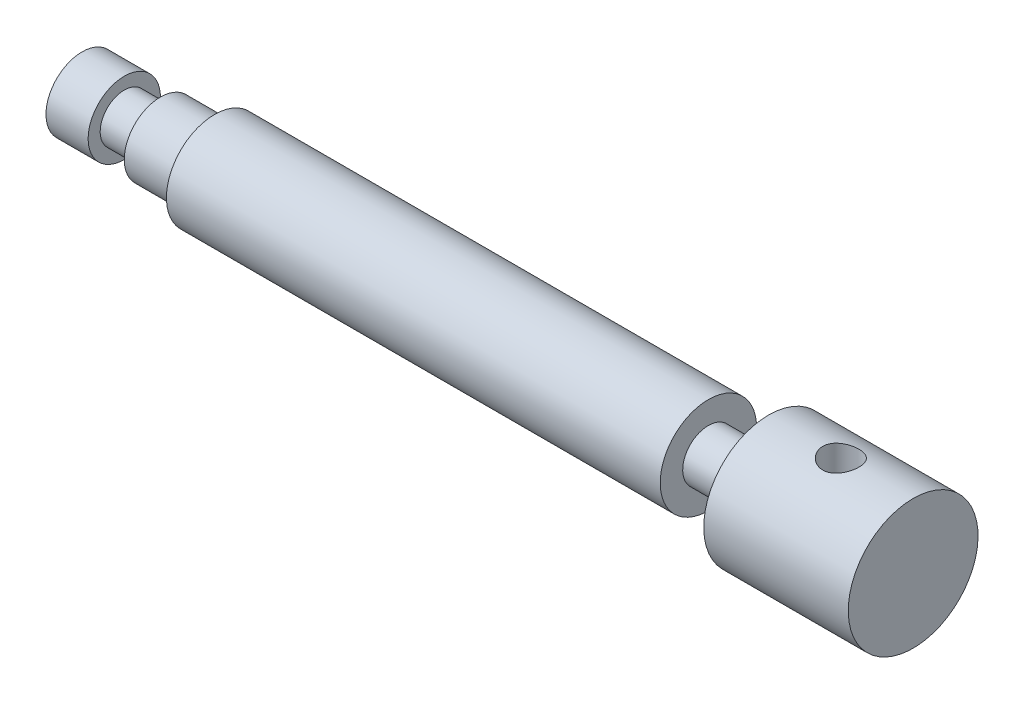
ISO-10303-21;
HEADER;
FILE_DESCRIPTION(('STEP AP214'),'2;1');
FILE_NAME('part.step','',(''),(''),'','','');
FILE_SCHEMA(('AUTOMOTIVE_DESIGN { 1 0 10303 214 1 1 1 1 }'));
ENDSEC;
DATA;
#1=APPLICATION_CONTEXT('core data for automotive mechanical design processes');
#2=APPLICATION_PROTOCOL_DEFINITION('international standard','automotive_design',2000,#1);
#3=PRODUCT_CONTEXT('',#1,'mechanical');
#4=PRODUCT('Part','Part','',(#3));
#5=PRODUCT_RELATED_PRODUCT_CATEGORY('part','',(#4));
#6=PRODUCT_DEFINITION_FORMATION('','',#4);
#7=PRODUCT_DEFINITION_CONTEXT('part definition',#1,'design');
#8=PRODUCT_DEFINITION('design','',#6,#7);
#9=PRODUCT_DEFINITION_SHAPE('','',#8);
#10=(LENGTH_UNIT() NAMED_UNIT(*) SI_UNIT(.MILLI.,.METRE.));
#11=(NAMED_UNIT(*) PLANE_ANGLE_UNIT() SI_UNIT($,.RADIAN.));
#12=(NAMED_UNIT(*) SI_UNIT($,.STERADIAN.) SOLID_ANGLE_UNIT());
#13=UNCERTAINTY_MEASURE_WITH_UNIT(LENGTH_MEASURE(1.E-05),#10,'distance_accuracy_value','');
#14=(GEOMETRIC_REPRESENTATION_CONTEXT(3) GLOBAL_UNCERTAINTY_ASSIGNED_CONTEXT((#13)) GLOBAL_UNIT_ASSIGNED_CONTEXT((#10,
#11,#12)) REPRESENTATION_CONTEXT('',''));
#15=CARTESIAN_POINT('',(0.,0.,0.));
#16=DIRECTION('',(0.,0.,1.));
#17=DIRECTION('',(1.,0.,0.));
#18=AXIS2_PLACEMENT_3D('',#15,#16,#17);
#19=CARTESIAN_POINT('',(41.,8.,0.));
#20=DIRECTION('',(1.,0.,0.));
#21=DIRECTION('',(0.,1.,0.));
#22=AXIS2_PLACEMENT_3D('',#19,#20,#21);
#23=PLANE('',#22);
#24=CARTESIAN_POINT('',(41.,0.,0.));
#25=DIRECTION('',(1.,0.,0.));
#26=DIRECTION('',(0.,1.,0.));
#27=AXIS2_PLACEMENT_3D('',#24,#25,#26);
#28=CIRCLE('',#27,8.);
#29=CARTESIAN_POINT('',(41.,8.,0.));
#30=VERTEX_POINT('',#29);
#31=EDGE_CURVE('E50',#30,#30,#28,.T.);
#32=ORIENTED_EDGE('',*,*,#31,.T.);
#33=EDGE_LOOP('',(#32));
#34=FACE_BOUND('',#33,.T.);
#35=CARTESIAN_POINT('',(41.,0.,0.));
#36=DIRECTION('',(1.,0.,0.));
#37=DIRECTION('',(0.,1.,0.));
#38=AXIS2_PLACEMENT_3D('',#35,#36,#37);
#39=CIRCLE('',#38,4.26787410544416);
#40=CARTESIAN_POINT('',(41.,4.26787410544416,0.));
#41=VERTEX_POINT('',#40);
#42=EDGE_CURVE('E93',#41,#41,#39,.T.);
#43=ORIENTED_EDGE('',*,*,#42,.F.);
#44=EDGE_LOOP('',(#43));
#45=FACE_BOUND('',#44,.T.);
#46=ADVANCED_FACE('F39',(#34,#45),#23,.T.);
#47=CARTESIAN_POINT('',(75.,0.,0.));
#48=DIRECTION('',(1.,0.,0.));
#49=DIRECTION('',(0.,1.,0.));
#50=AXIS2_PLACEMENT_3D('',#47,#48,#49);
#51=CYLINDRICAL_SURFACE('',#50,8.);
#52=CARTESIAN_POINT('',(-41.,0.,0.));
#53=DIRECTION('',(1.,0.,0.));
#54=DIRECTION('',(0.,1.,0.));
#55=AXIS2_PLACEMENT_3D('',#52,#53,#54);
#56=CIRCLE('',#55,7.99999999999999);
#57=CARTESIAN_POINT('',(-41.,7.99999999999999,0.));
#58=VERTEX_POINT('',#57);
#59=EDGE_CURVE('E54',#58,#58,#56,.T.);
#60=ORIENTED_EDGE('',*,*,#59,.T.);
#61=EDGE_LOOP('',(#60));
#62=FACE_BOUND('',#61,.T.);
#63=ORIENTED_EDGE('',*,*,#31,.F.);
#64=EDGE_LOOP('',(#63));
#65=FACE_BOUND('',#64,.T.);
#66=ADVANCED_FACE('F82',(#62,#65),#51,.T.);
#67=CARTESIAN_POINT('',(-41.,7.99999999999999,0.));
#68=DIRECTION('',(-1.,0.,0.));
#69=DIRECTION('',(0.,-1.,0.));
#70=AXIS2_PLACEMENT_3D('',#67,#68,#69);
#71=PLANE('',#70);
#72=CARTESIAN_POINT('',(-41.,0.,0.));
#73=DIRECTION('',(1.,0.,0.));
#74=DIRECTION('',(0.,1.,0.));
#75=AXIS2_PLACEMENT_3D('',#72,#73,#74);
#76=CIRCLE('',#75,5.99999999999999);
#77=CARTESIAN_POINT('',(-41.,5.99999999999999,0.));
#78=VERTEX_POINT('',#77);
#79=EDGE_CURVE('E120',#78,#78,#76,.T.);
#80=ORIENTED_EDGE('',*,*,#79,.T.);
#81=EDGE_LOOP('',(#80));
#82=FACE_BOUND('',#81,.T.);
#83=ORIENTED_EDGE('',*,*,#59,.F.);
#84=EDGE_LOOP('',(#83));
#85=FACE_BOUND('',#84,.T.);
#86=ADVANCED_FACE('F87',(#82,#85),#71,.T.);
#87=CARTESIAN_POINT('',(75.,0.,0.));
#88=DIRECTION('',(1.,0.,0.));
#89=DIRECTION('',(0.,1.,0.));
#90=AXIS2_PLACEMENT_3D('',#87,#88,#89);
#91=CYLINDRICAL_SURFACE('',#90,5.99999999999999);
#92=CARTESIAN_POINT('',(-50.,0.,0.));
#93=DIRECTION('',(1.,0.,0.));
#94=DIRECTION('',(0.,1.,0.));
#95=AXIS2_PLACEMENT_3D('',#92,#93,#94);
#96=CIRCLE('',#95,5.99999999999999);
#97=CARTESIAN_POINT('',(-50.,5.99999999999999,0.));
#98=VERTEX_POINT('',#97);
#99=EDGE_CURVE('E117',#98,#98,#96,.T.);
#100=ORIENTED_EDGE('',*,*,#99,.T.);
#101=EDGE_LOOP('',(#100));
#102=FACE_BOUND('',#101,.T.);
#103=ORIENTED_EDGE('',*,*,#79,.F.);
#104=EDGE_LOOP('',(#103));
#105=FACE_BOUND('',#104,.T.);
#106=ADVANCED_FACE('F127',(#102,#105),#91,.T.);
#107=CARTESIAN_POINT('',(-50.,3.99999999999999,0.));
#108=DIRECTION('',(-1.,0.,0.));
#109=DIRECTION('',(0.,-1.,0.));
#110=AXIS2_PLACEMENT_3D('',#107,#108,#109);
#111=PLANE('',#110);
#112=CARTESIAN_POINT('',(-50.,0.,0.));
#113=DIRECTION('',(1.,0.,0.));
#114=DIRECTION('',(0.,1.,0.));
#115=AXIS2_PLACEMENT_3D('',#112,#113,#114);
#116=CIRCLE('',#115,3.99999999999999);
#117=CARTESIAN_POINT('',(-50.,3.99999999999999,0.));
#118=VERTEX_POINT('',#117);
#119=EDGE_CURVE('E114',#118,#118,#116,.T.);
#120=ORIENTED_EDGE('',*,*,#119,.T.);
#121=EDGE_LOOP('',(#120));
#122=FACE_BOUND('',#121,.T.);
#123=ORIENTED_EDGE('',*,*,#99,.F.);
#124=EDGE_LOOP('',(#123));
#125=FACE_BOUND('',#124,.T.);
#126=ADVANCED_FACE('F133',(#122,#125),#111,.T.);
#127=CARTESIAN_POINT('',(75.,0.,0.));
#128=DIRECTION('',(1.,0.,0.));
#129=DIRECTION('',(0.,1.,0.));
#130=AXIS2_PLACEMENT_3D('',#127,#128,#129);
#131=CYLINDRICAL_SURFACE('',#130,3.99999999999999);
#132=CARTESIAN_POINT('',(-56.,0.,0.));
#133=DIRECTION('',(1.,0.,0.));
#134=DIRECTION('',(0.,1.,0.));
#135=AXIS2_PLACEMENT_3D('',#132,#133,#134);
#136=CIRCLE('',#135,3.99999999999999);
#137=CARTESIAN_POINT('',(-56.,3.99999999999999,0.));
#138=VERTEX_POINT('',#137);
#139=EDGE_CURVE('E111',#138,#138,#136,.T.);
#140=ORIENTED_EDGE('',*,*,#139,.T.);
#141=EDGE_LOOP('',(#140));
#142=FACE_BOUND('',#141,.T.);
#143=ORIENTED_EDGE('',*,*,#119,.F.);
#144=EDGE_LOOP('',(#143));
#145=FACE_BOUND('',#144,.T.);
#146=ADVANCED_FACE('F139',(#142,#145),#131,.T.);
#147=CARTESIAN_POINT('',(-56.,5.99999999999998,0.));
#148=DIRECTION('',(1.,0.,0.));
#149=DIRECTION('',(0.,1.,0.));
#150=AXIS2_PLACEMENT_3D('',#147,#148,#149);
#151=PLANE('',#150);
#152=CARTESIAN_POINT('',(-56.,0.,0.));
#153=DIRECTION('',(1.,0.,0.));
#154=DIRECTION('',(0.,1.,0.));
#155=AXIS2_PLACEMENT_3D('',#152,#153,#154);
#156=CIRCLE('',#155,5.99999999999998);
#157=CARTESIAN_POINT('',(-56.,5.99999999999998,0.));
#158=VERTEX_POINT('',#157);
#159=EDGE_CURVE('E108',#158,#158,#156,.T.);
#160=ORIENTED_EDGE('',*,*,#159,.T.);
#161=EDGE_LOOP('',(#160));
#162=FACE_BOUND('',#161,.T.);
#163=ORIENTED_EDGE('',*,*,#139,.F.);
#164=EDGE_LOOP('',(#163));
#165=FACE_BOUND('',#164,.T.);
#166=ADVANCED_FACE('F143',(#162,#165),#151,.T.);
#167=CARTESIAN_POINT('',(75.,0.,0.));
#168=DIRECTION('',(1.,0.,0.));
#169=DIRECTION('',(0.,1.,0.));
#170=AXIS2_PLACEMENT_3D('',#167,#168,#169);
#171=CYLINDRICAL_SURFACE('',#170,5.99999999999998);
#172=CARTESIAN_POINT('',(-63.,0.,0.));
#173=DIRECTION('',(1.,0.,0.));
#174=DIRECTION('',(0.,1.,0.));
#175=AXIS2_PLACEMENT_3D('',#172,#173,#174);
#176=CIRCLE('',#175,5.99999999999998);
#177=CARTESIAN_POINT('',(-63.,5.99999999999998,0.));
#178=VERTEX_POINT('',#177);
#179=EDGE_CURVE('E105',#178,#178,#176,.T.);
#180=ORIENTED_EDGE('',*,*,#179,.T.);
#181=EDGE_LOOP('',(#180));
#182=FACE_BOUND('',#181,.T.);
#183=ORIENTED_EDGE('',*,*,#159,.F.);
#184=EDGE_LOOP('',(#183));
#185=FACE_BOUND('',#184,.T.);
#186=ADVANCED_FACE('F147',(#182,#185),#171,.T.);
#187=CARTESIAN_POINT('',(-62.9999999999971,0.,0.));
#188=DIRECTION('',(-1.,0.,0.));
#189=DIRECTION('',(0.,-1.,0.));
#190=AXIS2_PLACEMENT_3D('',#187,#188,#189);
#191=PLANE('',#190);
#192=ORIENTED_EDGE('',*,*,#179,.F.);
#193=EDGE_LOOP('',(#192));
#194=FACE_BOUND('',#193,.T.);
#195=ADVANCED_FACE('F151',(#194),#191,.T.);
#196=CARTESIAN_POINT('',(75.,10.7746327543004,0.));
#197=DIRECTION('',(1.,0.,0.));
#198=DIRECTION('',(0.,1.,0.));
#199=AXIS2_PLACEMENT_3D('',#196,#197,#198);
#200=PLANE('',#199);
#201=CARTESIAN_POINT('',(75.,0.,0.));
#202=DIRECTION('',(1.,0.,0.));
#203=DIRECTION('',(0.,1.,0.));
#204=AXIS2_PLACEMENT_3D('',#201,#202,#203);
#205=CIRCLE('',#204,10.7746327543004);
#206=CARTESIAN_POINT('',(75.,10.7746327543004,0.));
#207=VERTEX_POINT('',#206);
#208=EDGE_CURVE('E102',#207,#207,#205,.T.);
#209=ORIENTED_EDGE('',*,*,#208,.T.);
#210=EDGE_LOOP('',(#209));
#211=FACE_BOUND('',#210,.T.);
#212=ADVANCED_FACE('F77',(#211),#200,.T.);
#213=CARTESIAN_POINT('',(75.,0.,0.));
#214=DIRECTION('',(1.,0.,0.));
#215=DIRECTION('',(0.,1.,0.));
#216=AXIS2_PLACEMENT_3D('',#213,#214,#215);
#217=CYLINDRICAL_SURFACE('',#216,10.7746327543004);
#218=CARTESIAN_POINT('',(60.,10.7746327543004,0.));
#219=CARTESIAN_POINT('',(60.0000033234242,10.7746305656465,0.165107473193337));
#220=CARTESIAN_POINT('',(60.013675785875,10.7708006709977,0.330249618551099));
#221=CARTESIAN_POINT('',(60.0678964351357,10.7558951124685,0.655758820973584));
#222=CARTESIAN_POINT('',(60.1084558646999,10.7448164175358,0.816123851168781));
#223=CARTESIAN_POINT('',(60.2150161864264,10.7166330551711,1.12733453214071));
#224=CARTESIAN_POINT('',(60.2809826395401,10.6995365475327,1.278192748626));
#225=CARTESIAN_POINT('',(60.4363521020987,10.6611141025951,1.5667058032163));
#226=CARTESIAN_POINT('',(60.5257572229373,10.6397877843097,1.70435945030532));
#227=CARTESIAN_POINT('',(60.7278326956823,10.5946005692911,1.96600904603294));
#228=CARTESIAN_POINT('',(60.8409825787477,10.5706933326272,2.08962664139882));
#229=CARTESIAN_POINT('',(61.086311679946,10.5233289491878,2.31639968016031));
#230=CARTESIAN_POINT('',(61.2184935846163,10.4998718664861,2.4195522298382));
#231=CARTESIAN_POINT('',(61.5012160582832,10.4555843054569,2.60436107225001));
#232=CARTESIAN_POINT('',(61.6520569822311,10.4348120050592,2.68557311108671));
#233=CARTESIAN_POINT('',(61.9659249001037,10.398931160782,2.82133070987303));
#234=CARTESIAN_POINT('',(62.1289494121735,10.383821467154,2.87588168383054));
#235=CARTESIAN_POINT('',(62.4583457919592,10.3614565818611,2.95543744977082));
#236=CARTESIAN_POINT('',(62.6245382605229,10.3540183174788,2.98113227225334));
#237=CARTESIAN_POINT('',(62.95902863031,10.3472922807527,3.00439890471877));
#238=CARTESIAN_POINT('',(63.1273260922532,10.3480028353133,3.00197648766323));
#239=CARTESIAN_POINT('',(63.4557884280051,10.3573308387286,2.96962321767775));
#240=CARTESIAN_POINT('',(63.6160445158683,10.3657054657805,2.94053710601376));
#241=CARTESIAN_POINT('',(63.9293066677298,10.3890278327953,2.85703908758132));
#242=CARTESIAN_POINT('',(64.0823121046309,10.4039761401602,2.80262499462509));
#243=CARTESIAN_POINT('',(64.3788850996378,10.4389682710829,2.66935017840358));
#244=CARTESIAN_POINT('',(64.5223156745355,10.4590716998426,2.59020094319277));
#245=CARTESIAN_POINT('',(64.7941515511581,10.5020780494278,2.40990357030673));
#246=CARTESIAN_POINT('',(64.9225536483112,10.5249815652039,2.30875075383231));
#247=CARTESIAN_POINT('',(65.1655025772917,10.5720094184699,2.08304041663388));
#248=CARTESIAN_POINT('',(65.2793911251981,10.5961481489255,1.95777626357842));
#249=CARTESIAN_POINT('',(65.4846862850355,10.6421963612183,1.68962917444697));
#250=CARTESIAN_POINT('',(65.5760918454972,10.6641057387666,1.54674541481811));
#251=CARTESIAN_POINT('',(65.7341528322371,10.7033822307676,1.24633569934049));
#252=CARTESIAN_POINT('',(65.8006800158981,10.7207256767153,1.08873896982054));
#253=CARTESIAN_POINT('',(65.906100841399,10.7487454795744,0.764002851016554));
#254=CARTESIAN_POINT('',(65.9450010855827,10.7594234293462,0.596865752032198));
#255=CARTESIAN_POINT('',(65.9930090851217,10.7726644439293,0.263403744056727));
#256=CARTESIAN_POINT('',(66.0030108212594,10.7754709308887,0.0972170100837569));
#257=CARTESIAN_POINT('',(65.9954192790277,10.7733575205312,-0.234462532458405));
#258=CARTESIAN_POINT('',(65.9778291313545,10.7684384997842,-0.399955417618516));
#259=CARTESIAN_POINT('',(65.9162832293163,10.7515848162363,-0.722296320454978));
#260=CARTESIAN_POINT('',(65.8728341984806,10.7397850737281,-0.879248797663804));
#261=CARTESIAN_POINT('',(65.7613995188285,10.7105164054596,-1.18361581755125));
#262=CARTESIAN_POINT('',(65.6934110969318,10.6930468390017,-1.33102928004984));
#263=CARTESIAN_POINT('',(65.5332236866908,10.6538160047737,-1.61554505432912));
#264=CARTESIAN_POINT('',(65.4405490564369,10.6319727814853,-1.75236798068524));
#265=CARTESIAN_POINT('',(65.2342108157195,10.5865150023629,-2.00883131508715));
#266=CARTESIAN_POINT('',(65.1205426743085,10.5629000648014,-2.12846800396618));
#267=CARTESIAN_POINT('',(64.8712598944778,10.5156511106879,-2.35098930004886));
#268=CARTESIAN_POINT('',(64.7350749858754,10.4920391156547,-2.45324097730919));
#269=CARTESIAN_POINT('',(64.4469733038041,10.4482635394156,-2.63346411366943));
#270=CARTESIAN_POINT('',(64.2950571283395,10.4280998272048,-2.71143649526514));
#271=CARTESIAN_POINT('',(63.9804926479226,10.3937389375806,-2.84030865596225));
#272=CARTESIAN_POINT('',(63.817909492478,10.37950884814,-2.89135819778439));
#273=CARTESIAN_POINT('',(63.485996887953,10.3586447770673,-2.9652473174534));
#274=CARTESIAN_POINT('',(63.316669370011,10.352008636983,-2.9880949113746));
#275=CARTESIAN_POINT('',(62.9825856839384,10.3472754476864,-3.00444069631457));
#276=CARTESIAN_POINT('',(62.8178830135885,10.3488810598852,-2.99896080941088));
#277=CARTESIAN_POINT('',(62.4918494251163,10.3597478968268,-2.96120115935276));
#278=CARTESIAN_POINT('',(62.330518405021,10.3690088896941,-2.92892220792076));
#279=CARTESIAN_POINT('',(62.0172242261002,10.3939580701728,-2.83909718019108));
#280=CARTESIAN_POINT('',(61.8651885981182,10.4095864056983,-2.78178605067867));
#281=CARTESIAN_POINT('',(61.5727722899575,10.445506218938,-2.64370522594157));
#282=CARTESIAN_POINT('',(61.4323935892191,10.4657984864302,-2.56293155702039));
#283=CARTESIAN_POINT('',(61.1624436993317,10.509567018041,-2.37719933723741));
#284=CARTESIAN_POINT('',(61.0333592635706,10.5331241200474,-2.27155231039483));
#285=CARTESIAN_POINT('',(60.7944192136544,10.5803378504577,-2.04035765715196));
#286=CARTESIAN_POINT('',(60.6845683801939,10.6039945021135,-1.91480509777773));
#287=CARTESIAN_POINT('',(60.4846134560257,10.6494203236456,-1.64373555103367));
#288=CARTESIAN_POINT('',(60.3950455043505,10.6711306954065,-1.49781232476246));
#289=CARTESIAN_POINT('',(60.2418503938172,10.7095552063036,-1.19237622438478));
#290=CARTESIAN_POINT('',(60.1782080830495,10.7262722621911,-1.03287135399463));
#291=CARTESIAN_POINT('',(60.0861022997769,10.7508999665891,-0.728510788632155));
#292=CARTESIAN_POINT('',(60.0538930150792,10.7597320328197,-0.584852634621526));
#293=CARTESIAN_POINT('',(60.0108416587757,10.7715990559198,-0.294138553967173));
#294=CARTESIAN_POINT('',(59.999997039387,10.7746347040235,-0.147083034582975));
#295=CARTESIAN_POINT('',(60.,10.7746327543004,0.));
#296=B_SPLINE_CURVE_WITH_KNOTS('',3,(#218,#219,#220,#221,#222,#223,#224,#225,#226,#227,#228,
#229,#230,#231,#232,#233,#234,#235,#236,#237,#238,#239,#240,#241,#242,#243,#244,#245,#246,#247,
#248,#249,#250,#251,#252,#253,#254,#255,#256,#257,#258,#259,#260,#261,#262,#263,#264,#265,#266,
#267,#268,#269,#270,#271,#272,#273,#274,#275,#276,#277,#278,#279,#280,#281,#282,#283,#284,#285,
#286,#287,#288,#289,#290,#291,#292,#293,#294,#295),.UNSPECIFIED.,.T.,.F.,(4,2,2,2,2,2,2,2,2,2,2,
2,2,2,2,2,2,2,2,2,2,2,2,2,2,2,2,2,2,2,2,2,2,2,2,2,2,2,4),(0.,0.494782733342046,
0.989772490127898,1.48409363966876,1.97845933378231,2.48398230374633,2.98957670281235,
3.50474927960677,4.01981719784831,4.52228716271001,5.02465396351589,5.51163535500226,
5.99865878814324,6.49158940784308,6.98462494599991,7.49526193338872,8.00592279736469,
8.51918086282592,9.03231622748868,9.52939821920792,10.0264238139026,10.5140164579095,
11.0016642197131,11.4994887388639,11.9974208273552,12.5107608784333,13.0240814226921,
13.5345155886979,14.0448046363194,14.5368162059261,15.028812873436,15.5162877918621,
16.0038453189056,16.5069347828528,17.0101491174914,17.525419335511,18.0403879768941,
18.4812088828603,18.9219772167927),.UNSPECIFIED.);
#297=CARTESIAN_POINT('',(60.,10.7746327543004,0.));
#298=VERTEX_POINT('',#297);
#299=EDGE_CURVE('E42',#298,#298,#296,.T.);
#300=ORIENTED_EDGE('',*,*,#299,.F.);
#301=EDGE_LOOP('',(#300));
#302=FACE_BOUND('',#301,.T.);
#303=CARTESIAN_POINT('',(60.,-10.7746327543004,0.));
#304=CARTESIAN_POINT('',(60.0000033234242,-10.7746305656465,-0.165107473193338));
#305=CARTESIAN_POINT('',(60.013675785875,-10.7708006709977,-0.330249618551099));
#306=CARTESIAN_POINT('',(60.0678964351357,-10.7558951124685,-0.655758820973584));
#307=CARTESIAN_POINT('',(60.1084558646999,-10.7448164175358,-0.816123851168781));
#308=CARTESIAN_POINT('',(60.2150161864264,-10.716633055171,-1.12733453214071));
#309=CARTESIAN_POINT('',(60.2809826395401,-10.6995365475327,-1.278192748626));
#310=CARTESIAN_POINT('',(60.4363521020987,-10.6611141025951,-1.5667058032163));
#311=CARTESIAN_POINT('',(60.5257572229373,-10.6397877843097,-1.70435945030532));
#312=CARTESIAN_POINT('',(60.7278326956823,-10.5946005692911,-1.96600904603294));
#313=CARTESIAN_POINT('',(60.8409825787477,-10.5706933326272,-2.08962664139882));
#314=CARTESIAN_POINT('',(61.086311679946,-10.5233289491878,-2.31639968016031));
#315=CARTESIAN_POINT('',(61.2184935846163,-10.4998718664861,-2.4195522298382));
#316=CARTESIAN_POINT('',(61.5012160582832,-10.4555843054569,-2.60436107225001));
#317=CARTESIAN_POINT('',(61.6520569822311,-10.4348120050592,-2.68557311108671));
#318=CARTESIAN_POINT('',(61.9659249001037,-10.398931160782,-2.82133070987304));
#319=CARTESIAN_POINT('',(62.1289494121735,-10.383821467154,-2.87588168383054));
#320=CARTESIAN_POINT('',(62.4583457919592,-10.3614565818611,-2.95543744977082));
#321=CARTESIAN_POINT('',(62.6245382605229,-10.3540183174788,-2.98113227225334));
#322=CARTESIAN_POINT('',(62.95902863031,-10.3472922807527,-3.00439890471877));
#323=CARTESIAN_POINT('',(63.1273260922532,-10.3480028353133,-3.00197648766323));
#324=CARTESIAN_POINT('',(63.4557884280051,-10.3573308387286,-2.96962321767775));
#325=CARTESIAN_POINT('',(63.6160445158683,-10.3657054657805,-2.94053710601376));
#326=CARTESIAN_POINT('',(63.9293066677298,-10.3890278327953,-2.85703908758132));
#327=CARTESIAN_POINT('',(64.0823121046309,-10.4039761401602,-2.80262499462509));
#328=CARTESIAN_POINT('',(64.3788850996378,-10.4389682710829,-2.66935017840358));
#329=CARTESIAN_POINT('',(64.5223156745355,-10.4590716998426,-2.59020094319277));
#330=CARTESIAN_POINT('',(64.7941515511581,-10.5020780494278,-2.40990357030673));
#331=CARTESIAN_POINT('',(64.9225536483112,-10.5249815652039,-2.30875075383231));
#332=CARTESIAN_POINT('',(65.1655025772917,-10.5720094184699,-2.08304041663388));
#333=CARTESIAN_POINT('',(65.2793911251981,-10.5961481489255,-1.95777626357842));
#334=CARTESIAN_POINT('',(65.4846862850355,-10.6421963612183,-1.68962917444697));
#335=CARTESIAN_POINT('',(65.5760918454972,-10.6641057387666,-1.54674541481811));
#336=CARTESIAN_POINT('',(65.7341528322371,-10.7033822307676,-1.2463356993405));
#337=CARTESIAN_POINT('',(65.8006800158981,-10.7207256767153,-1.08873896982054));
#338=CARTESIAN_POINT('',(65.906100841399,-10.7487454795744,-0.764002851016556));
#339=CARTESIAN_POINT('',(65.9450010855827,-10.7594234293462,-0.5968657520322));
#340=CARTESIAN_POINT('',(65.9930090851217,-10.7726644439293,-0.263403744056728));
#341=CARTESIAN_POINT('',(66.0030108212594,-10.7754709308887,-0.097217010083758));
#342=CARTESIAN_POINT('',(65.9954192790277,-10.7733575205312,0.234462532458403));
#343=CARTESIAN_POINT('',(65.9778291313545,-10.7684384997842,0.399955417618514));
#344=CARTESIAN_POINT('',(65.9162832293163,-10.7515848162363,0.722296320454976));
#345=CARTESIAN_POINT('',(65.8728341984806,-10.7397850737281,0.879248797663804));
#346=CARTESIAN_POINT('',(65.7613995188286,-10.7105164054596,1.18361581755125));
#347=CARTESIAN_POINT('',(65.6934110969319,-10.6930468390017,1.33102928004984));
#348=CARTESIAN_POINT('',(65.5332236866908,-10.6538160047737,1.61554505432912));
#349=CARTESIAN_POINT('',(65.4405490564369,-10.6319727814853,1.75236798068524));
#350=CARTESIAN_POINT('',(65.2342108157195,-10.5865150023629,2.00883131508715));
#351=CARTESIAN_POINT('',(65.1205426743085,-10.5629000648014,2.12846800396618));
#352=CARTESIAN_POINT('',(64.8712598944778,-10.5156511106879,2.35098930004886));
#353=CARTESIAN_POINT('',(64.7350749858754,-10.4920391156547,2.45324097730919));
#354=CARTESIAN_POINT('',(64.4469733038041,-10.4482635394156,2.63346411366944));
#355=CARTESIAN_POINT('',(64.2950571283395,-10.4280998272048,2.71143649526514));
#356=CARTESIAN_POINT('',(63.9804926479226,-10.3937389375806,2.84030865596225));
#357=CARTESIAN_POINT('',(63.8179094924781,-10.37950884814,2.89135819778439));
#358=CARTESIAN_POINT('',(63.485996887953,-10.3586447770673,2.9652473174534));
#359=CARTESIAN_POINT('',(63.316669370011,-10.352008636983,2.98809491137459));
#360=CARTESIAN_POINT('',(62.9825856839384,-10.3472754476864,3.00444069631457));
#361=CARTESIAN_POINT('',(62.8178830135885,-10.3488810598852,2.99896080941088));
#362=CARTESIAN_POINT('',(62.4918494251163,-10.3597478968268,2.96120115935276));
#363=CARTESIAN_POINT('',(62.330518405021,-10.3690088896941,2.92892220792076));
#364=CARTESIAN_POINT('',(62.0172242261002,-10.3939580701728,2.83909718019108));
#365=CARTESIAN_POINT('',(61.8651885981182,-10.4095864056983,2.78178605067867));
#366=CARTESIAN_POINT('',(61.5727722899575,-10.445506218938,2.64370522594157));
#367=CARTESIAN_POINT('',(61.4323935892191,-10.4657984864301,2.56293155702039));
#368=CARTESIAN_POINT('',(61.1624436993317,-10.509567018041,2.37719933723741));
#369=CARTESIAN_POINT('',(61.0333592635706,-10.5331241200474,2.27155231039483));
#370=CARTESIAN_POINT('',(60.7944192136544,-10.5803378504577,2.04035765715196));
#371=CARTESIAN_POINT('',(60.6845683801939,-10.6039945021135,1.91480509777773));
#372=CARTESIAN_POINT('',(60.4846134560257,-10.6494203236456,1.64373555103367));
#373=CARTESIAN_POINT('',(60.3950455043505,-10.6711306954065,1.49781232476246));
#374=CARTESIAN_POINT('',(60.2418503938172,-10.7095552063036,1.19237622438478));
#375=CARTESIAN_POINT('',(60.1782080830495,-10.7262722621911,1.03287135399464));
#376=CARTESIAN_POINT('',(60.0861022997769,-10.7508999665891,0.728510788632161));
#377=CARTESIAN_POINT('',(60.0538930150792,-10.7597320328196,0.58485263462153));
#378=CARTESIAN_POINT('',(60.0108416587757,-10.7715990559198,0.294138553967176));
#379=CARTESIAN_POINT('',(59.999997039387,-10.7746347040235,0.147083034582976));
#380=CARTESIAN_POINT('',(60.,-10.7746327543004,0.));
#381=B_SPLINE_CURVE_WITH_KNOTS('',3,(#303,#304,#305,#306,#307,#308,#309,#310,#311,#312,#313,
#314,#315,#316,#317,#318,#319,#320,#321,#322,#323,#324,#325,#326,#327,#328,#329,#330,#331,#332,
#333,#334,#335,#336,#337,#338,#339,#340,#341,#342,#343,#344,#345,#346,#347,#348,#349,#350,#351,
#352,#353,#354,#355,#356,#357,#358,#359,#360,#361,#362,#363,#364,#365,#366,#367,#368,#369,#370,
#371,#372,#373,#374,#375,#376,#377,#378,#379,#380),.UNSPECIFIED.,.T.,.F.,(4,2,2,2,2,2,2,2,2,2,2,
2,2,2,2,2,2,2,2,2,2,2,2,2,2,2,2,2,2,2,2,2,2,2,2,2,2,2,4),(0.,0.494782733342046,
0.989772490127899,1.48409363966876,1.97845933378231,2.48398230374633,2.98957670281235,
3.50474927960678,4.01981719784832,4.52228716271001,5.02465396351589,5.51163535500226,
5.99865878814324,6.49158940784308,6.98462494599991,7.49526193338872,8.00592279736469,
8.51918086282592,9.03231622748868,9.52939821920792,10.0264238139026,10.5140164579095,
11.0016642197131,11.4994887388639,11.9974208273552,12.5107608784333,13.0240814226921,
13.5345155886979,14.0448046363193,14.5368162059261,15.028812873436,15.5162877918621,
16.0038453189056,16.5069347828528,17.0101491174914,17.525419335511,18.0403879768941,
18.4812088828603,18.9219772167927),.UNSPECIFIED.);
#382=CARTESIAN_POINT('',(60.,-10.7746327543004,0.));
#383=VERTEX_POINT('',#382);
#384=EDGE_CURVE('E10',#383,#383,#381,.T.);
#385=ORIENTED_EDGE('',*,*,#384,.F.);
#386=EDGE_LOOP('',(#385));
#387=FACE_BOUND('',#386,.T.);
#388=CARTESIAN_POINT('',(51.,0.,0.));
#389=DIRECTION('',(1.,0.,0.));
#390=DIRECTION('',(0.,1.,0.));
#391=AXIS2_PLACEMENT_3D('',#388,#389,#390);
#392=CIRCLE('',#391,10.7746327543004);
#393=CARTESIAN_POINT('',(51.,10.7746327543004,0.));
#394=VERTEX_POINT('',#393);
#395=EDGE_CURVE('E96',#394,#394,#392,.T.);
#396=ORIENTED_EDGE('',*,*,#395,.T.);
#397=EDGE_LOOP('',(#396));
#398=FACE_BOUND('',#397,.T.);
#399=ORIENTED_EDGE('',*,*,#208,.F.);
#400=EDGE_LOOP('',(#399));
#401=FACE_BOUND('',#400,.T.);
#402=ADVANCED_FACE('F59',(#302,#387,#398,#401),#217,.T.);
#403=CARTESIAN_POINT('',(51.,4.26787410544416,0.));
#404=DIRECTION('',(-1.,0.,0.));
#405=DIRECTION('',(0.,-1.,0.));
#406=AXIS2_PLACEMENT_3D('',#403,#404,#405);
#407=PLANE('',#406);
#408=CARTESIAN_POINT('',(51.,0.,0.));
#409=DIRECTION('',(1.,0.,0.));
#410=DIRECTION('',(0.,1.,0.));
#411=AXIS2_PLACEMENT_3D('',#408,#409,#410);
#412=CIRCLE('',#411,4.26787410544416);
#413=CARTESIAN_POINT('',(51.,4.26787410544416,0.));
#414=VERTEX_POINT('',#413);
#415=EDGE_CURVE('E94',#414,#414,#412,.T.);
#416=ORIENTED_EDGE('',*,*,#415,.T.);
#417=EDGE_LOOP('',(#416));
#418=FACE_BOUND('',#417,.T.);
#419=ORIENTED_EDGE('',*,*,#395,.F.);
#420=EDGE_LOOP('',(#419));
#421=FACE_BOUND('',#420,.T.);
#422=ADVANCED_FACE('F70',(#418,#421),#407,.T.);
#423=CARTESIAN_POINT('',(75.,0.,0.));
#424=DIRECTION('',(1.,0.,0.));
#425=DIRECTION('',(0.,1.,0.));
#426=AXIS2_PLACEMENT_3D('',#423,#424,#425);
#427=CYLINDRICAL_SURFACE('',#426,4.26787410544416);
#428=ORIENTED_EDGE('',*,*,#42,.T.);
#429=EDGE_LOOP('',(#428));
#430=FACE_BOUND('',#429,.T.);
#431=ORIENTED_EDGE('',*,*,#415,.F.);
#432=EDGE_LOOP('',(#431));
#433=FACE_BOUND('',#432,.T.);
#434=ADVANCED_FACE('F67',(#430,#433),#427,.T.);
#435=CARTESIAN_POINT('',(63.,-10.7746327543004,0.));
#436=DIRECTION('',(0.,1.,0.));
#437=DIRECTION('',(-1.,0.,0.));
#438=AXIS2_PLACEMENT_3D('',#435,#436,#437);
#439=CYLINDRICAL_SURFACE('',#438,3.00000000000001);
#440=ORIENTED_EDGE('',*,*,#384,.T.);
#441=EDGE_LOOP('',(#440));
#442=FACE_BOUND('',#441,.T.);
#443=ORIENTED_EDGE('',*,*,#299,.T.);
#444=EDGE_LOOP('',(#443));
#445=FACE_BOUND('',#444,.T.);
#446=ADVANCED_FACE('F63',(#442,#445),#439,.F.);
#447=CLOSED_SHELL('',(#46,#66,#86,#106,#126,#146,#166,#186,#195,#212,#402,#422,#434,#446));
#448=MANIFOLD_SOLID_BREP('B2',#447);
#449=ADVANCED_BREP_SHAPE_REPRESENTATION('',(#18,#448),#14);
#450=SHAPE_DEFINITION_REPRESENTATION(#9,#449);
ENDSEC;
END-ISO-10303-21;
